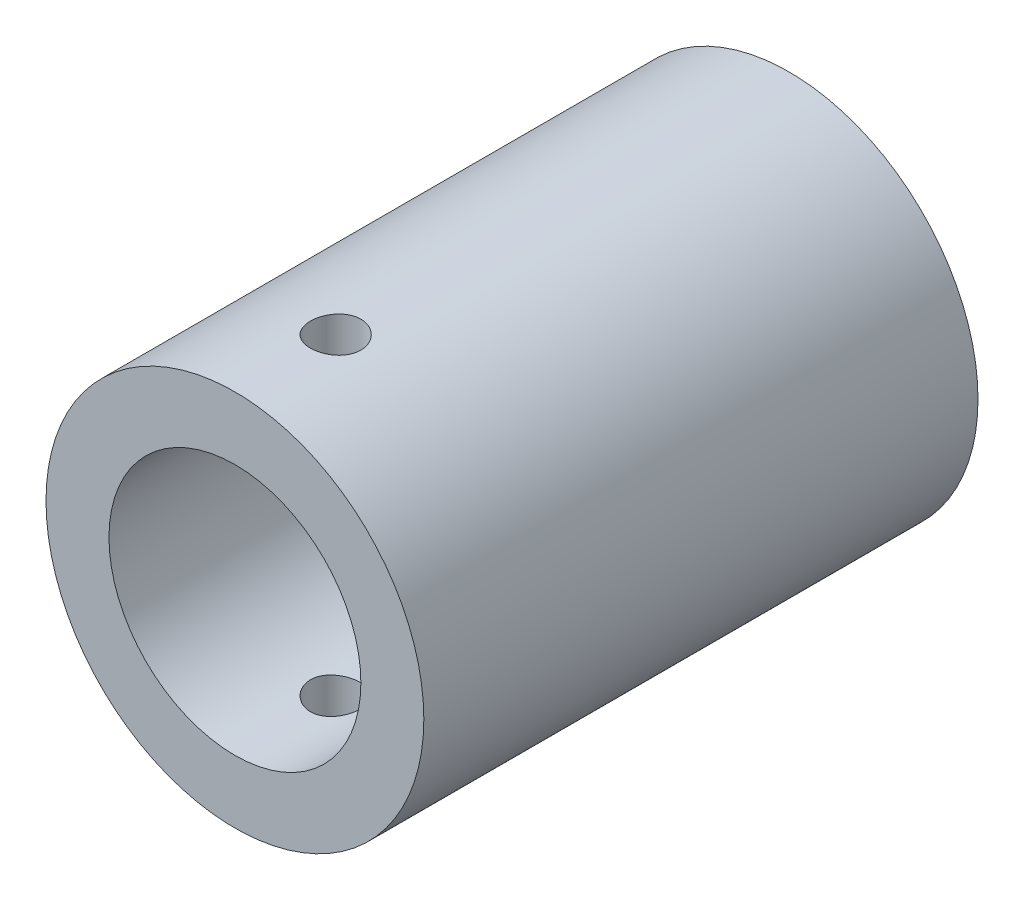
ISO-10303-21;
HEADER;
FILE_DESCRIPTION(('STEP AP214'),'2;1');
FILE_NAME('part.step','',(''),(''),'','','');
FILE_SCHEMA(('AUTOMOTIVE_DESIGN { 1 0 10303 214 1 1 1 1 }'));
ENDSEC;
DATA;
#1=APPLICATION_CONTEXT('core data for automotive mechanical design processes');
#2=APPLICATION_PROTOCOL_DEFINITION('international standard','automotive_design',2000,#1);
#3=PRODUCT_CONTEXT('',#1,'mechanical');
#4=PRODUCT('Part','Part','',(#3));
#5=PRODUCT_RELATED_PRODUCT_CATEGORY('part','',(#4));
#6=PRODUCT_DEFINITION_FORMATION('','',#4);
#7=PRODUCT_DEFINITION_CONTEXT('part definition',#1,'design');
#8=PRODUCT_DEFINITION('design','',#6,#7);
#9=PRODUCT_DEFINITION_SHAPE('','',#8);
#10=(LENGTH_UNIT() NAMED_UNIT(*) SI_UNIT(.MILLI.,.METRE.));
#11=(NAMED_UNIT(*) PLANE_ANGLE_UNIT() SI_UNIT($,.RADIAN.));
#12=(NAMED_UNIT(*) SI_UNIT($,.STERADIAN.) SOLID_ANGLE_UNIT());
#13=UNCERTAINTY_MEASURE_WITH_UNIT(LENGTH_MEASURE(1.E-05),#10,'distance_accuracy_value','');
#14=(GEOMETRIC_REPRESENTATION_CONTEXT(3) GLOBAL_UNCERTAINTY_ASSIGNED_CONTEXT((#13)) GLOBAL_UNIT_ASSIGNED_CONTEXT((#10,
#11,#12)) REPRESENTATION_CONTEXT('',''));
#15=CARTESIAN_POINT('',(0.,0.,0.));
#16=DIRECTION('',(0.,0.,1.));
#17=DIRECTION('',(1.,0.,0.));
#18=AXIS2_PLACEMENT_3D('',#15,#16,#17);
#19=CARTESIAN_POINT('',(0.,0.,44.));
#20=DIRECTION('',(0.,0.,-1.));
#21=DIRECTION('',(-1.,0.,0.));
#22=AXIS2_PLACEMENT_3D('',#19,#20,#21);
#23=CYLINDRICAL_SURFACE('',#22,15.);
#24=CARTESIAN_POINT('',(0.,-15.,38.));
#25=CARTESIAN_POINT('',(0.111808835669284,-14.9999983574254,37.9999952902931));
#26=CARTESIAN_POINT('',(0.223685979276279,-14.9987367072719,37.9905924620375));
#27=CARTESIAN_POINT('',(0.444322725138078,-14.993825111269,37.9532336509504));
#28=CARTESIAN_POINT('',(0.553079022333037,-14.9901727244172,37.9252587051029));
#29=CARTESIAN_POINT('',(0.764248312626984,-14.9808907984907,37.8515982824585));
#30=CARTESIAN_POINT('',(0.866665683058492,-14.9752626421097,37.8059251889616));
#31=CARTESIAN_POINT('',(1.0623638950303,-14.9626538666039,37.6981930861937));
#32=CARTESIAN_POINT('',(1.15564620633702,-14.9556734655857,37.6361367188335));
#33=CARTESIAN_POINT('',(1.33102582250468,-14.9410899478996,37.4969867383958));
#34=CARTESIAN_POINT('',(1.41305798549586,-14.9334835816211,37.4198113549915));
#35=CARTESIAN_POINT('',(1.56304735673101,-14.9185313755795,37.2527898109233));
#36=CARTESIAN_POINT('',(1.63100381997221,-14.9111855496234,37.1629429800042));
#37=CARTESIAN_POINT('',(1.75115902268908,-14.8975543544019,36.972700877055));
#38=CARTESIAN_POINT('',(1.80329607482578,-14.8912731776576,36.8722663175214));
#39=CARTESIAN_POINT('',(1.8899384500729,-14.8805258737923,36.6639689327632));
#40=CARTESIAN_POINT('',(1.92444453245278,-14.8760596685121,36.5561064276467));
#41=CARTESIAN_POINT('',(1.97464606772174,-14.8694793656867,36.3366941894983));
#42=CARTESIAN_POINT('',(1.99045204228507,-14.8673514537014,36.2251701654671));
#43=CARTESIAN_POINT('',(2.00314680548117,-14.8656465160931,36.001033820394));
#44=CARTESIAN_POINT('',(2.00003645633601,-14.866069374204,35.8884215491891));
#45=CARTESIAN_POINT('',(1.97507745939235,-14.8694055577299,35.6660788699721));
#46=CARTESIAN_POINT('',(1.95335097531762,-14.8723026462234,35.5563344701143));
#47=CARTESIAN_POINT('',(1.89196724634372,-14.8802355277475,35.3420631632399));
#48=CARTESIAN_POINT('',(1.85230959261457,-14.8852713695413,35.237536375245));
#49=CARTESIAN_POINT('',(1.75605929143191,-14.8969326111103,35.0362903652928));
#50=CARTESIAN_POINT('',(1.69941397913749,-14.903562941239,34.9395966288057));
#51=CARTESIAN_POINT('',(1.57083393344289,-14.9176623621993,34.7570409180823));
#52=CARTESIAN_POINT('',(1.49889840502385,-14.9251314966353,34.6711795074458));
#53=CARTESIAN_POINT('',(1.34110490026362,-14.9401389923359,34.5120169874181));
#54=CARTESIAN_POINT('',(1.25514170702645,-14.947677435412,34.4388201572977));
#55=CARTESIAN_POINT('',(1.07209417013341,-14.9619192381826,34.3078779550716));
#56=CARTESIAN_POINT('',(0.97500979444237,-14.9686225954715,34.2501326274765));
#57=CARTESIAN_POINT('',(0.772392219730469,-14.9804439374358,34.1517308823053));
#58=CARTESIAN_POINT('',(0.66685557884123,-14.9855612720896,34.1110814689537));
#59=CARTESIAN_POINT('',(0.450370924336248,-14.9936282590407,34.0481106810277));
#60=CARTESIAN_POINT('',(0.339423199542256,-14.9965780268993,34.0257883293606));
#61=CARTESIAN_POINT('',(0.116166903325642,-14.9999624137686,34.0002415672289));
#62=CARTESIAN_POINT('',(0.00387503454704113,-15.0004159384905,33.9968735982165));
#63=CARTESIAN_POINT('',(-0.219671617218718,-14.9988079153852,34.0089516641272));
#64=CARTESIAN_POINT('',(-0.330926425345665,-14.996746428686,34.0243972417824));
#65=CARTESIAN_POINT('',(-0.548813715572938,-14.990351753581,34.073544653384));
#66=CARTESIAN_POINT('',(-0.655462016512045,-14.9860271430292,34.1071775683222));
#67=CARTESIAN_POINT('',(-0.861605098793561,-14.9755900925429,34.1916729659371));
#68=CARTESIAN_POINT('',(-0.961099607015639,-14.9694775843944,34.2425361060132));
#69=CARTESIAN_POINT('',(-1.15074887861608,-14.9560983737007,34.3603921555833));
#70=CARTESIAN_POINT('',(-1.24084581439661,-14.9488251504572,34.4274773657133));
#71=CARTESIAN_POINT('',(-1.4085529469919,-14.9339572870998,34.5757433292243));
#72=CARTESIAN_POINT('',(-1.48616257662379,-14.9263626324062,34.6569247225164));
#73=CARTESIAN_POINT('',(-1.62720549423098,-14.9116490247351,34.8317131426396));
#74=CARTESIAN_POINT('',(-1.69054327608938,-14.904533487753,34.9253975667382));
#75=CARTESIAN_POINT('',(-1.80058351078814,-14.8916413300182,35.1221594102809));
#76=CARTESIAN_POINT('',(-1.84728633510347,-14.8858646793678,35.2252366199104));
#77=CARTESIAN_POINT('',(-1.92257836500746,-14.8763281178008,35.4375572420277));
#78=CARTESIAN_POINT('',(-1.95122028846796,-14.872562342326,35.5467816852108));
#79=CARTESIAN_POINT('',(-1.98974667143959,-14.8674574869829,35.7685436321288));
#80=CARTESIAN_POINT('',(-1.99963213426782,-14.8661182773134,35.8810809583244));
#81=CARTESIAN_POINT('',(-2.00034485806189,-14.8660223129545,36.1053234908535));
#82=CARTESIAN_POINT('',(-1.99132219194493,-14.8672452228252,36.2170282409642));
#83=CARTESIAN_POINT('',(-1.95479376686689,-14.872091838742,36.4373178751039));
#84=CARTESIAN_POINT('',(-1.92728801483269,-14.8757155438883,36.545902760302));
#85=CARTESIAN_POINT('',(-1.85462310332207,-14.8849489027276,36.7568436832516));
#86=CARTESIAN_POINT('',(-1.80947220819041,-14.890557626594,36.8592026111169));
#87=CARTESIAN_POINT('',(-1.70281342759737,-14.9031304571282,37.0549158838261));
#88=CARTESIAN_POINT('',(-1.64130522630429,-14.910094589966,37.148270054756));
#89=CARTESIAN_POINT('',(-1.50312448509508,-14.9246596718306,37.3240896499284));
#90=CARTESIAN_POINT('',(-1.42634027226901,-14.9322650575408,37.4064669477551));
#91=CARTESIAN_POINT('',(-1.26002169349824,-14.9472171900166,37.5572232163615));
#92=CARTESIAN_POINT('',(-1.17048434072978,-14.9545638756898,37.6255988987502));
#93=CARTESIAN_POINT('',(-0.980752987852825,-14.9682063513753,37.7466671384665));
#94=CARTESIAN_POINT('',(-0.880514620743968,-14.9744974642689,37.7992906665552));
#95=CARTESIAN_POINT('',(-0.67259240958733,-14.9852732065897,37.8868805985451));
#96=CARTESIAN_POINT('',(-0.56491667896989,-14.9897597692431,37.9218659086249));
#97=CARTESIAN_POINT('',(-0.380588408098419,-14.9953572174327,37.9649480063852));
#98=CARTESIAN_POINT('',(-0.305091081955779,-14.9970896363507,37.9780732435236));
#99=CARTESIAN_POINT('',(-0.153073171616112,-14.9994115849077,37.9956008141655));
#100=CARTESIAN_POINT('',(-0.0765525964512404,-15.000001124628,38.0000032246136));
#101=CARTESIAN_POINT('',(0.,-15.,38.));
#102=B_SPLINE_CURVE_WITH_KNOTS('',3,(#24,#25,#26,#27,#28,#29,#30,#31,#32,#33,#34,#35,#36,#37,
#38,#39,#40,#41,#42,#43,#44,#45,#46,#47,#48,#49,#50,#51,#52,#53,#54,#55,#56,#57,#58,#59,#60,#61,
#62,#63,#64,#65,#66,#67,#68,#69,#70,#71,#72,#73,#74,#75,#76,#77,#78,#79,#80,#81,#82,#83,#84,#85,
#86,#87,#88,#89,#90,#91,#92,#93,#94,#95,#96,#97,#98,#99,#100,#101),.UNSPECIFIED.,.T.,.F.,(4,2,2,
2,2,2,2,2,2,2,2,2,2,2,2,2,2,2,2,2,2,2,2,2,2,2,2,2,2,2,2,2,2,2,2,2,2,2,4),(0.,0.335146851305743,
0.670636430885044,1.0058916928274,1.34109292564034,1.67815978443559,2.01524447904836,
2.35362721511648,2.69199537766205,3.02835355914359,3.3646964092492,3.69884885098044,
4.0330089117585,4.36821583137898,4.70344018443797,5.04130544484849,5.37917167852296,
5.71717620202539,6.05516270391743,6.39058584992061,6.72600084354478,7.06015363396464,
7.39431917503546,7.73043274769884,8.06656158258762,8.40487704535451,8.74318495273048,
9.08050074735455,9.41779849783635,9.75242927496624,10.0870599266874,10.4215340370262,
10.756014605959,11.0930366783511,11.4301378125116,11.7686952667452,12.1068890499242,
12.3363573904731,12.5658237068544),.UNSPECIFIED.);
#103=CARTESIAN_POINT('',(0.,-15.,38.));
#104=VERTEX_POINT('',#103);
#105=EDGE_CURVE('E78',#104,#104,#102,.T.);
#106=ORIENTED_EDGE('',*,*,#105,.T.);
#107=EDGE_LOOP('',(#106));
#108=FACE_BOUND('',#107,.T.);
#109=CARTESIAN_POINT('',(0.,15.,38.));
#110=CARTESIAN_POINT('',(-0.111808835669284,14.9999983574254,37.9999952902931));
#111=CARTESIAN_POINT('',(-0.22368597927628,14.9987367072719,37.9905924620375));
#112=CARTESIAN_POINT('',(-0.444322725138079,14.9938251112691,37.9532336509504));
#113=CARTESIAN_POINT('',(-0.553079022333038,14.9901727244172,37.9252587051029));
#114=CARTESIAN_POINT('',(-0.764248312626986,14.9808907984907,37.8515982824585));
#115=CARTESIAN_POINT('',(-0.866665683058495,14.9752626421097,37.8059251889616));
#116=CARTESIAN_POINT('',(-1.0623638950303,14.9626538666039,37.6981930861937));
#117=CARTESIAN_POINT('',(-1.15564620633703,14.9556734655857,37.6361367188335));
#118=CARTESIAN_POINT('',(-1.33102582250468,14.9410899478996,37.4969867383958));
#119=CARTESIAN_POINT('',(-1.41305798549587,14.9334835816211,37.4198113549915));
#120=CARTESIAN_POINT('',(-1.56304735673102,14.9185313755795,37.2527898109233));
#121=CARTESIAN_POINT('',(-1.63100381997221,14.9111855496234,37.1629429800042));
#122=CARTESIAN_POINT('',(-1.75115902268908,14.8975543544019,36.972700877055));
#123=CARTESIAN_POINT('',(-1.80329607482578,14.8912731776576,36.8722663175214));
#124=CARTESIAN_POINT('',(-1.8899384500729,14.8805258737923,36.6639689327632));
#125=CARTESIAN_POINT('',(-1.92444453245278,14.8760596685121,36.5561064276467));
#126=CARTESIAN_POINT('',(-1.97464606772174,14.8694793656867,36.3366941894983));
#127=CARTESIAN_POINT('',(-1.99045204228507,14.8673514537014,36.2251701654671));
#128=CARTESIAN_POINT('',(-2.00314680548117,14.8656465160931,36.001033820394));
#129=CARTESIAN_POINT('',(-2.00003645633601,14.866069374204,35.8884215491891));
#130=CARTESIAN_POINT('',(-1.97507745939234,14.8694055577299,35.6660788699721));
#131=CARTESIAN_POINT('',(-1.95335097531762,14.8723026462234,35.5563344701143));
#132=CARTESIAN_POINT('',(-1.89196724634372,14.8802355277475,35.3420631632399));
#133=CARTESIAN_POINT('',(-1.85230959261457,14.8852713695413,35.237536375245));
#134=CARTESIAN_POINT('',(-1.75605929143191,14.8969326111103,35.0362903652928));
#135=CARTESIAN_POINT('',(-1.69941397913749,14.903562941239,34.9395966288057));
#136=CARTESIAN_POINT('',(-1.57083393344289,14.9176623621993,34.7570409180823));
#137=CARTESIAN_POINT('',(-1.49889840502385,14.9251314966353,34.6711795074458));
#138=CARTESIAN_POINT('',(-1.34110490026362,14.9401389923359,34.5120169874181));
#139=CARTESIAN_POINT('',(-1.25514170702645,14.947677435412,34.4388201572977));
#140=CARTESIAN_POINT('',(-1.07209417013341,14.9619192381826,34.3078779550716));
#141=CARTESIAN_POINT('',(-0.97500979444237,14.9686225954715,34.2501326274765));
#142=CARTESIAN_POINT('',(-0.772392219730469,14.9804439374358,34.1517308823053));
#143=CARTESIAN_POINT('',(-0.66685557884123,14.9855612720896,34.1110814689537));
#144=CARTESIAN_POINT('',(-0.450370924336248,14.9936282590407,34.0481106810277));
#145=CARTESIAN_POINT('',(-0.339423199542255,14.9965780268993,34.0257883293606));
#146=CARTESIAN_POINT('',(-0.116166903325641,14.9999624137686,34.0002415672289));
#147=CARTESIAN_POINT('',(-0.00387503454704033,15.0004159384905,33.9968735982165));
#148=CARTESIAN_POINT('',(0.219671617218719,14.9988079153852,34.0089516641272));
#149=CARTESIAN_POINT('',(0.330926425345666,14.996746428686,34.0243972417824));
#150=CARTESIAN_POINT('',(0.548813715572939,14.990351753581,34.073544653384));
#151=CARTESIAN_POINT('',(0.655462016512046,14.9860271430292,34.1071775683222));
#152=CARTESIAN_POINT('',(0.861605098793562,14.9755900925429,34.1916729659371));
#153=CARTESIAN_POINT('',(0.96109960701564,14.9694775843944,34.2425361060132));
#154=CARTESIAN_POINT('',(1.15074887861608,14.9560983737007,34.3603921555833));
#155=CARTESIAN_POINT('',(1.24084581439661,14.9488251504572,34.4274773657133));
#156=CARTESIAN_POINT('',(1.4085529469919,14.9339572870998,34.5757433292243));
#157=CARTESIAN_POINT('',(1.48616257662379,14.9263626324062,34.6569247225164));
#158=CARTESIAN_POINT('',(1.62720549423098,14.9116490247351,34.8317131426396));
#159=CARTESIAN_POINT('',(1.69054327608939,14.904533487753,34.9253975667382));
#160=CARTESIAN_POINT('',(1.80058351078814,14.8916413300182,35.1221594102809));
#161=CARTESIAN_POINT('',(1.84728633510347,14.8858646793678,35.2252366199104));
#162=CARTESIAN_POINT('',(1.92257836500746,14.8763281178008,35.4375572420277));
#163=CARTESIAN_POINT('',(1.95122028846796,14.872562342326,35.5467816852108));
#164=CARTESIAN_POINT('',(1.98974667143959,14.8674574869829,35.7685436321288));
#165=CARTESIAN_POINT('',(1.99963213426782,14.8661182773134,35.8810809583244));
#166=CARTESIAN_POINT('',(2.00034485806189,14.8660223129545,36.1053234908535));
#167=CARTESIAN_POINT('',(1.99132219194493,14.8672452228252,36.2170282409642));
#168=CARTESIAN_POINT('',(1.95479376686689,14.872091838742,36.4373178751039));
#169=CARTESIAN_POINT('',(1.92728801483269,14.8757155438883,36.545902760302));
#170=CARTESIAN_POINT('',(1.85462310332207,14.8849489027276,36.7568436832516));
#171=CARTESIAN_POINT('',(1.80947220819041,14.890557626594,36.8592026111169));
#172=CARTESIAN_POINT('',(1.70281342759737,14.9031304571282,37.0549158838261));
#173=CARTESIAN_POINT('',(1.64130522630429,14.910094589966,37.148270054756));
#174=CARTESIAN_POINT('',(1.50312448509508,14.9246596718306,37.3240896499284));
#175=CARTESIAN_POINT('',(1.42634027226901,14.9322650575408,37.4064669477551));
#176=CARTESIAN_POINT('',(1.26002169349824,14.9472171900166,37.5572232163615));
#177=CARTESIAN_POINT('',(1.17048434072978,14.9545638756898,37.6255988987502));
#178=CARTESIAN_POINT('',(0.980752987852825,14.9682063513753,37.7466671384665));
#179=CARTESIAN_POINT('',(0.880514620743967,14.9744974642689,37.7992906665552));
#180=CARTESIAN_POINT('',(0.67259240958733,14.9852732065897,37.8868805985451));
#181=CARTESIAN_POINT('',(0.56491667896989,14.9897597692431,37.9218659086249));
#182=CARTESIAN_POINT('',(0.380588408098419,14.9953572174327,37.9649480063852));
#183=CARTESIAN_POINT('',(0.305091081955779,14.9970896363507,37.9780732435236));
#184=CARTESIAN_POINT('',(0.153073171616112,14.9994115849077,37.9956008141655));
#185=CARTESIAN_POINT('',(0.0765525964512405,15.000001124628,38.0000032246136));
#186=CARTESIAN_POINT('',(0.,15.,38.));
#187=B_SPLINE_CURVE_WITH_KNOTS('',3,(#109,#110,#111,#112,#113,#114,#115,#116,#117,#118,#119,
#120,#121,#122,#123,#124,#125,#126,#127,#128,#129,#130,#131,#132,#133,#134,#135,#136,#137,#138,
#139,#140,#141,#142,#143,#144,#145,#146,#147,#148,#149,#150,#151,#152,#153,#154,#155,#156,#157,
#158,#159,#160,#161,#162,#163,#164,#165,#166,#167,#168,#169,#170,#171,#172,#173,#174,#175,#176,
#177,#178,#179,#180,#181,#182,#183,#184,#185,#186),.UNSPECIFIED.,.T.,.F.,(4,2,2,2,2,2,2,2,2,2,2,
2,2,2,2,2,2,2,2,2,2,2,2,2,2,2,2,2,2,2,2,2,2,2,2,2,2,2,4),(0.,0.335146851305744,
0.670636430885045,1.00589169282741,1.34109292564035,1.6781597844356,2.01524447904836,
2.35362721511648,2.69199537766205,3.0283535591436,3.36469640924921,3.69884885098044,
4.0330089117585,4.36821583137898,4.70344018443797,5.04130544484849,5.37917167852296,
5.71717620202539,6.05516270391743,6.39058584992061,6.72600084354478,7.06015363396464,
7.39431917503546,7.73043274769884,8.06656158258762,8.40487704535451,8.74318495273048,
9.08050074735455,9.41779849783635,9.75242927496624,10.0870599266874,10.4215340370262,
10.756014605959,11.0930366783511,11.4301378125116,11.7686952667452,12.1068890499242,
12.3363573904731,12.5658237068544),.UNSPECIFIED.);
#188=CARTESIAN_POINT('',(0.,15.,38.));
#189=VERTEX_POINT('',#188);
#190=EDGE_CURVE('E83',#189,#189,#187,.T.);
#191=ORIENTED_EDGE('',*,*,#190,.T.);
#192=EDGE_LOOP('',(#191));
#193=FACE_BOUND('',#192,.T.);
#194=CARTESIAN_POINT('',(0.,0.,44.));
#195=DIRECTION('',(0.,0.,1.));
#196=DIRECTION('',(1.,0.,0.));
#197=AXIS2_PLACEMENT_3D('',#194,#195,#196);
#198=CIRCLE('',#197,15.);
#199=CARTESIAN_POINT('',(15.,0.,44.));
#200=VERTEX_POINT('',#199);
#201=EDGE_CURVE('E10',#200,#200,#198,.T.);
#202=ORIENTED_EDGE('',*,*,#201,.F.);
#203=EDGE_LOOP('',(#202));
#204=FACE_BOUND('',#203,.T.);
#205=CARTESIAN_POINT('',(0.,0.,0.));
#206=DIRECTION('',(0.,0.,1.));
#207=DIRECTION('',(1.,0.,0.));
#208=AXIS2_PLACEMENT_3D('',#205,#206,#207);
#209=CIRCLE('',#208,15.);
#210=CARTESIAN_POINT('',(15.,0.,0.));
#211=VERTEX_POINT('',#210);
#212=EDGE_CURVE('E48',#211,#211,#209,.T.);
#213=ORIENTED_EDGE('',*,*,#212,.T.);
#214=EDGE_LOOP('',(#213));
#215=FACE_BOUND('',#214,.T.);
#216=ADVANCED_FACE('F35',(#108,#193,#204,#215),#23,.T.);
#217=CARTESIAN_POINT('',(0.,0.,44.));
#218=DIRECTION('',(0.,0.,1.));
#219=DIRECTION('',(1.,0.,0.));
#220=AXIS2_PLACEMENT_3D('',#217,#218,#219);
#221=PLANE('',#220);
#222=CARTESIAN_POINT('',(0.,0.,44.));
#223=DIRECTION('',(0.,0.,1.));
#224=DIRECTION('',(1.,0.,0.));
#225=AXIS2_PLACEMENT_3D('',#222,#223,#224);
#226=CIRCLE('',#225,10.);
#227=CARTESIAN_POINT('',(10.,0.,44.));
#228=VERTEX_POINT('',#227);
#229=EDGE_CURVE('E56',#228,#228,#226,.T.);
#230=ORIENTED_EDGE('',*,*,#229,.F.);
#231=EDGE_LOOP('',(#230));
#232=FACE_BOUND('',#231,.T.);
#233=ORIENTED_EDGE('',*,*,#201,.T.);
#234=EDGE_LOOP('',(#233));
#235=FACE_BOUND('',#234,.T.);
#236=ADVANCED_FACE('F95',(#232,#235),#221,.T.);
#237=CARTESIAN_POINT('',(0.,0.,0.));
#238=DIRECTION('',(0.,0.,1.));
#239=DIRECTION('',(1.,0.,0.));
#240=AXIS2_PLACEMENT_3D('',#237,#238,#239);
#241=PLANE('',#240);
#242=ORIENTED_EDGE('',*,*,#212,.F.);
#243=EDGE_LOOP('',(#242));
#244=FACE_BOUND('',#243,.T.);
#245=ADVANCED_FACE('F97',(#244),#241,.F.);
#246=CARTESIAN_POINT('',(0.,0.,14.));
#247=DIRECTION('',(0.,0.,1.));
#248=DIRECTION('',(1.,0.,0.));
#249=AXIS2_PLACEMENT_3D('',#246,#247,#248);
#250=CYLINDRICAL_SURFACE('',#249,10.);
#251=CARTESIAN_POINT('',(0.,-10.,38.));
#252=CARTESIAN_POINT('',(-0.111153813585266,-9.99999795161743,37.9999959110033));
#253=CARTESIAN_POINT('',(-0.222359320403044,-9.99812770356462,37.9907023140647));
#254=CARTESIAN_POINT('',(-0.441627015378037,-9.99084731246462,37.9538029997695));
#255=CARTESIAN_POINT('',(-0.549686635082711,-9.98543435720372,37.926182734397));
#256=CARTESIAN_POINT('',(-0.759460610526625,-9.97167298556573,37.8535174527584));
#257=CARTESIAN_POINT('',(-0.861180935866266,-9.96332738153436,37.8084891263106));
#258=CARTESIAN_POINT('',(-1.05561597772845,-9.94460796070629,37.7023355049774));
#259=CARTESIAN_POINT('',(-1.14833123015162,-9.93423426471414,37.6412111687856));
#260=CARTESIAN_POINT('',(-1.32338695462973,-9.9124433065994,37.5037230114171));
#261=CARTESIAN_POINT('',(-1.40558790231705,-9.90101491008695,37.4271832892176));
#262=CARTESIAN_POINT('',(-1.55607351321606,-9.87848360905177,37.2614151672166));
#263=CARTESIAN_POINT('',(-1.62435708954085,-9.86738073000847,37.1721857773298));
#264=CARTESIAN_POINT('',(-1.74566350669524,-9.8466488362523,36.9825676139762));
#265=CARTESIAN_POINT('',(-1.79854187773173,-9.83703414729892,36.8820847124073));
#266=CARTESIAN_POINT('',(-1.88661133316062,-9.82052536116836,36.6734363619918));
#267=CARTESIAN_POINT('',(-1.92180416487448,-9.81363099523923,36.5652716733073));
#268=CARTESIAN_POINT('',(-1.97305059976966,-9.80345610504409,36.3458312721842));
#269=CARTESIAN_POINT('',(-1.98934899591755,-9.80012940214375,36.2346149117155));
#270=CARTESIAN_POINT('',(-2.00310425545224,-9.79732750121254,36.0109803572713));
#271=CARTESIAN_POINT('',(-2.000563045427,-9.79785190935681,35.8985622873597));
#272=CARTESIAN_POINT('',(-1.97690914620364,-9.80265102296369,35.677506423958));
#273=CARTESIAN_POINT('',(-1.95607708048781,-9.80686905717527,35.5688371887454));
#274=CARTESIAN_POINT('',(-1.8968757692461,-9.81849092320002,35.356567846674));
#275=CARTESIAN_POINT('',(-1.85850568620136,-9.82589490715558,35.252967982162));
#276=CARTESIAN_POINT('',(-1.76504956734944,-9.84311237000816,35.0529694765928));
#277=CARTESIAN_POINT('',(-1.70985230246423,-9.85294179627409,34.9566242408617));
#278=CARTESIAN_POINT('',(-1.58438714914536,-9.87389237546124,34.7744583000544));
#279=CARTESIAN_POINT('',(-1.51411752871366,-9.88501367676732,34.6886388062977));
#280=CARTESIAN_POINT('',(-1.35899986912117,-9.90754042482924,34.5283411950861));
#281=CARTESIAN_POINT('',(-1.27391232242489,-9.9189473842181,34.4540948642817));
#282=CARTESIAN_POINT('',(-1.09237004812402,-9.94057697428817,34.3208923073975));
#283=CARTESIAN_POINT('',(-0.99591517475878,-9.95079958977947,34.2619362774128));
#284=CARTESIAN_POINT('',(-0.794118773757844,-9.96893380321774,34.160944981548));
#285=CARTESIAN_POINT('',(-0.688763639170602,-9.97684177696544,34.1189362127109));
#286=CARTESIAN_POINT('',(-0.472297952897329,-9.98942817975716,34.0532790519229));
#287=CARTESIAN_POINT('',(-0.361188100144898,-9.99410700001063,34.0296284358527));
#288=CARTESIAN_POINT('',(-0.138358811254299,-9.99965343733735,34.0016870924114));
#289=CARTESIAN_POINT('',(-0.0266806566511506,-10.0005834930494,33.9970791609195));
#290=CARTESIAN_POINT('',(0.195849868385429,-9.99870103860205,34.0064997178844));
#291=CARTESIAN_POINT('',(0.306702284887587,-9.99588873882892,34.0205271587052));
#292=CARTESIAN_POINT('',(0.523411319893082,-9.98687664016035,34.0665567470879));
#293=CARTESIAN_POINT('',(0.629303896679806,-9.98070752808413,34.0983961369958));
#294=CARTESIAN_POINT('',(0.834247254999333,-9.96567104122065,34.1789679653116));
#295=CARTESIAN_POINT('',(0.933297523275077,-9.95680346428454,34.2277016693537));
#296=CARTESIAN_POINT('',(1.12308234737243,-9.93719823066589,34.3413649813026));
#297=CARTESIAN_POINT('',(1.21370025350438,-9.92643900874104,34.4064855620779));
#298=CARTESIAN_POINT('',(1.38283603823841,-9.90429469659765,34.5508183824146));
#299=CARTESIAN_POINT('',(1.46135261786152,-9.89290953936776,34.6300321327997));
#300=CARTESIAN_POINT('',(1.60528118154835,-9.8705860711393,34.8017467037822));
#301=CARTESIAN_POINT('',(1.67047540489731,-9.85965720466608,34.8944314884427));
#302=CARTESIAN_POINT('',(1.78437084010241,-9.83968383592388,35.0896227227134));
#303=CARTESIAN_POINT('',(1.83307271184581,-9.83063925826685,35.1921287791471));
#304=CARTESIAN_POINT('',(1.91230368316392,-9.81553481168766,35.4035364922991));
#305=CARTESIAN_POINT('',(1.9429269995821,-9.80945949744373,35.5124016824206));
#306=CARTESIAN_POINT('',(1.98541730325439,-9.8009487358405,35.7338669069818));
#307=CARTESIAN_POINT('',(1.99728673645023,-9.79851281382223,35.8464664524187));
#308=CARTESIAN_POINT('',(2.00184182173494,-9.79758299262758,36.0700177290886));
#309=CARTESIAN_POINT('',(1.99487157614179,-9.79901838378602,36.180962297854));
#310=CARTESIAN_POINT('',(1.96270460820012,-9.80551146969228,36.4000632998101));
#311=CARTESIAN_POINT('',(1.9375080322586,-9.81056913534338,36.5082197553896));
#312=CARTESIAN_POINT('',(1.86975713699791,-9.82370528438317,36.7184554224811));
#313=CARTESIAN_POINT('',(1.82724501343469,-9.83177642037661,36.8205487210048));
#314=CARTESIAN_POINT('',(1.72610928920321,-9.85003429948341,37.0162074414689));
#315=CARTESIAN_POINT('',(1.66748433754977,-9.86022121997788,37.1097721474503));
#316=CARTESIAN_POINT('',(1.53461182957283,-9.88177921046451,37.2874311443006));
#317=CARTESIAN_POINT('',(1.46011577447036,-9.89316745819399,37.3713375305352));
#318=CARTESIAN_POINT('',(1.29812873802628,-9.91572163743909,37.5255724110583));
#319=CARTESIAN_POINT('',(1.21063477430667,-9.92688751726369,37.5958977806345));
#320=CARTESIAN_POINT('',(1.02403525817649,-9.94787664775943,37.7216692878929));
#321=CARTESIAN_POINT('',(0.924817768859665,-9.95768462438492,37.77695200656));
#322=CARTESIAN_POINT('',(0.71833272188146,-9.9747025017,37.8699722451932));
#323=CARTESIAN_POINT('',(0.611072521726249,-9.98191474277232,37.907725579065));
#324=CARTESIAN_POINT('',(0.419642977847557,-9.99152745190741,37.9573038960894));
#325=CARTESIAN_POINT('',(0.336563328027568,-9.99468606316903,37.9732863874155));
#326=CARTESIAN_POINT('',(0.168999050420134,-9.99892308279786,37.9946358247167));
#327=CARTESIAN_POINT('',(0.084514467497238,-10.0000015574631,38.0000031090195));
#328=CARTESIAN_POINT('',(0.,-10.,38.));
#329=B_SPLINE_CURVE_WITH_KNOTS('',3,(#251,#252,#253,#254,#255,#256,#257,#258,#259,#260,#261,
#262,#263,#264,#265,#266,#267,#268,#269,#270,#271,#272,#273,#274,#275,#276,#277,#278,#279,#280,
#281,#282,#283,#284,#285,#286,#287,#288,#289,#290,#291,#292,#293,#294,#295,#296,#297,#298,#299,
#300,#301,#302,#303,#304,#305,#306,#307,#308,#309,#310,#311,#312,#313,#314,#315,#316,#317,#318,
#319,#320,#321,#322,#323,#324,#325,#326,#327,#328),.UNSPECIFIED.,.T.,.F.,(4,2,2,2,2,2,2,2,2,2,2,
2,2,2,2,2,2,2,2,2,2,2,2,2,2,2,2,2,2,2,2,2,2,2,2,2,2,2,4),(0.,0.333152261322515,
0.666569301382646,0.999667470500682,1.33274580446172,1.66986534022437,2.00701119349473,
2.34722390011846,2.68740298730395,3.02312370207174,3.35881008562451,3.68943454012557,
4.02007478507459,4.35294980407185,4.68586309499341,5.02476504982701,5.3636713507964,
5.70310549708048,6.04249851396072,6.37621471352531,6.70991215315735,7.04060907901447,
7.37133078432045,7.70610132066717,8.0409077669186,8.38081257158453,8.72070377446934,
9.05880762065447,9.3968673666083,9.72879445135404,10.0607188698522,10.3918392250622,
10.7229873516373,11.0597615247829,11.3966130906586,11.7369899335128,12.0770591103504,
12.3303755057979,12.5836838274199),.UNSPECIFIED.);
#330=CARTESIAN_POINT('',(0.,-10.,38.));
#331=VERTEX_POINT('',#330);
#332=EDGE_CURVE('E39',#331,#331,#329,.T.);
#333=ORIENTED_EDGE('',*,*,#332,.T.);
#334=EDGE_LOOP('',(#333));
#335=FACE_BOUND('',#334,.T.);
#336=CARTESIAN_POINT('',(0.,9.99999999999999,38.));
#337=CARTESIAN_POINT('',(0.111153813585266,9.99999795161741,37.9999959110033));
#338=CARTESIAN_POINT('',(0.222359320403044,9.99812770356462,37.9907023140647));
#339=CARTESIAN_POINT('',(0.441627015378039,9.99084731246463,37.9538029997695));
#340=CARTESIAN_POINT('',(0.549686635082712,9.98543435720372,37.926182734397));
#341=CARTESIAN_POINT('',(0.759460610526629,9.97167298556573,37.8535174527584));
#342=CARTESIAN_POINT('',(0.861180935866273,9.96332738153436,37.8084891263106));
#343=CARTESIAN_POINT('',(1.05561597772846,9.94460796070629,37.7023355049774));
#344=CARTESIAN_POINT('',(1.14833123015163,9.93423426471414,37.6412111687856));
#345=CARTESIAN_POINT('',(1.32338695462973,9.91244330659939,37.5037230114171));
#346=CARTESIAN_POINT('',(1.40558790231705,9.90101491008695,37.4271832892176));
#347=CARTESIAN_POINT('',(1.55607351321606,9.87848360905177,37.2614151672166));
#348=CARTESIAN_POINT('',(1.62435708954085,9.86738073000848,37.1721857773298));
#349=CARTESIAN_POINT('',(1.74566350669524,9.8466488362523,36.9825676139762));
#350=CARTESIAN_POINT('',(1.79854187773173,9.83703414729892,36.8820847124073));
#351=CARTESIAN_POINT('',(1.88661133316062,9.82052536116836,36.6734363619918));
#352=CARTESIAN_POINT('',(1.92180416487448,9.81363099523923,36.5652716733073));
#353=CARTESIAN_POINT('',(1.97305059976966,9.80345610504409,36.3458312721842));
#354=CARTESIAN_POINT('',(1.98934899591755,9.80012940214375,36.2346149117155));
#355=CARTESIAN_POINT('',(2.00310425545224,9.79732750121254,36.0109803572713));
#356=CARTESIAN_POINT('',(2.000563045427,9.79785190935681,35.8985622873597));
#357=CARTESIAN_POINT('',(1.97690914620364,9.80265102296369,35.677506423958));
#358=CARTESIAN_POINT('',(1.95607708048781,9.80686905717527,35.5688371887454));
#359=CARTESIAN_POINT('',(1.8968757692461,9.81849092320002,35.356567846674));
#360=CARTESIAN_POINT('',(1.85850568620136,9.82589490715558,35.252967982162));
#361=CARTESIAN_POINT('',(1.76504956734944,9.84311237000816,35.0529694765928));
#362=CARTESIAN_POINT('',(1.70985230246423,9.85294179627409,34.9566242408617));
#363=CARTESIAN_POINT('',(1.58438714914536,9.87389237546124,34.7744583000544));
#364=CARTESIAN_POINT('',(1.51411752871366,9.88501367676732,34.6886388062977));
#365=CARTESIAN_POINT('',(1.35899986912117,9.90754042482924,34.5283411950861));
#366=CARTESIAN_POINT('',(1.27391232242489,9.9189473842181,34.4540948642817));
#367=CARTESIAN_POINT('',(1.09237004812402,9.94057697428817,34.3208923073975));
#368=CARTESIAN_POINT('',(0.99591517475878,9.95079958977947,34.2619362774128));
#369=CARTESIAN_POINT('',(0.794118773757844,9.96893380321774,34.160944981548));
#370=CARTESIAN_POINT('',(0.688763639170601,9.97684177696544,34.1189362127109));
#371=CARTESIAN_POINT('',(0.472297952897329,9.98942817975716,34.0532790519229));
#372=CARTESIAN_POINT('',(0.361188100144897,9.99410700001063,34.0296284358527));
#373=CARTESIAN_POINT('',(0.138358811254298,9.99965343733736,34.0016870924114));
#374=CARTESIAN_POINT('',(0.0266806566511501,10.0005834930494,33.9970791609195));
#375=CARTESIAN_POINT('',(-0.19584986838543,9.99870103860205,34.0064997178844));
#376=CARTESIAN_POINT('',(-0.306702284887589,9.99588873882892,34.0205271587052));
#377=CARTESIAN_POINT('',(-0.523411319893084,9.98687664016035,34.0665567470879));
#378=CARTESIAN_POINT('',(-0.629303896679808,9.98070752808413,34.0983961369958));
#379=CARTESIAN_POINT('',(-0.834247254999336,9.96567104122065,34.1789679653116));
#380=CARTESIAN_POINT('',(-0.933297523275082,9.95680346428453,34.2277016693537));
#381=CARTESIAN_POINT('',(-1.12308234737244,9.93719823066589,34.3413649813026));
#382=CARTESIAN_POINT('',(-1.21370025350438,9.92643900874103,34.4064855620779));
#383=CARTESIAN_POINT('',(-1.38283603823842,9.90429469659765,34.5508183824146));
#384=CARTESIAN_POINT('',(-1.46135261786153,9.89290953936776,34.6300321327997));
#385=CARTESIAN_POINT('',(-1.60528118154835,9.8705860711393,34.8017467037822));
#386=CARTESIAN_POINT('',(-1.67047540489731,9.85965720466608,34.8944314884427));
#387=CARTESIAN_POINT('',(-1.78437084010241,9.83968383592388,35.0896227227134));
#388=CARTESIAN_POINT('',(-1.83307271184581,9.83063925826685,35.1921287791471));
#389=CARTESIAN_POINT('',(-1.91230368316392,9.81553481168766,35.4035364922991));
#390=CARTESIAN_POINT('',(-1.9429269995821,9.80945949744373,35.5124016824206));
#391=CARTESIAN_POINT('',(-1.98541730325439,9.8009487358405,35.7338669069818));
#392=CARTESIAN_POINT('',(-1.99728673645023,9.79851281382223,35.8464664524187));
#393=CARTESIAN_POINT('',(-2.00184182173494,9.79758299262758,36.0700177290886));
#394=CARTESIAN_POINT('',(-1.99487157614179,9.79901838378602,36.180962297854));
#395=CARTESIAN_POINT('',(-1.96270460820012,9.80551146969228,36.4000632998101));
#396=CARTESIAN_POINT('',(-1.9375080322586,9.81056913534338,36.5082197553896));
#397=CARTESIAN_POINT('',(-1.86975713699791,9.82370528438317,36.7184554224811));
#398=CARTESIAN_POINT('',(-1.82724501343469,9.83177642037661,36.8205487210048));
#399=CARTESIAN_POINT('',(-1.72610928920321,9.85003429948341,37.0162074414689));
#400=CARTESIAN_POINT('',(-1.66748433754977,9.86022121997788,37.1097721474503));
#401=CARTESIAN_POINT('',(-1.53461182957283,9.88177921046451,37.2874311443006));
#402=CARTESIAN_POINT('',(-1.46011577447036,9.89316745819399,37.3713375305352));
#403=CARTESIAN_POINT('',(-1.29812873802628,9.91572163743909,37.5255724110583));
#404=CARTESIAN_POINT('',(-1.21063477430667,9.92688751726369,37.5958977806345));
#405=CARTESIAN_POINT('',(-1.02403525817649,9.94787664775943,37.7216692878929));
#406=CARTESIAN_POINT('',(-0.924817768859664,9.95768462438492,37.77695200656));
#407=CARTESIAN_POINT('',(-0.718332721881459,9.9747025017,37.8699722451932));
#408=CARTESIAN_POINT('',(-0.611072521726248,9.98191474277232,37.907725579065));
#409=CARTESIAN_POINT('',(-0.419642977847556,9.99152745190741,37.9573038960894));
#410=CARTESIAN_POINT('',(-0.336563328027567,9.99468606316904,37.9732863874155));
#411=CARTESIAN_POINT('',(-0.168999050420133,9.99892308279785,37.9946358247167));
#412=CARTESIAN_POINT('',(-0.0845144674972375,10.0000015574631,38.0000031090195));
#413=CARTESIAN_POINT('',(0.,9.99999999999999,38.));
#414=B_SPLINE_CURVE_WITH_KNOTS('',3,(#336,#337,#338,#339,#340,#341,#342,#343,#344,#345,#346,
#347,#348,#349,#350,#351,#352,#353,#354,#355,#356,#357,#358,#359,#360,#361,#362,#363,#364,#365,
#366,#367,#368,#369,#370,#371,#372,#373,#374,#375,#376,#377,#378,#379,#380,#381,#382,#383,#384,
#385,#386,#387,#388,#389,#390,#391,#392,#393,#394,#395,#396,#397,#398,#399,#400,#401,#402,#403,
#404,#405,#406,#407,#408,#409,#410,#411,#412,#413),.UNSPECIFIED.,.T.,.F.,(4,2,2,2,2,2,2,2,2,2,2,
2,2,2,2,2,2,2,2,2,2,2,2,2,2,2,2,2,2,2,2,2,2,2,2,2,2,2,4),(0.,0.333152261322517,
0.666569301382647,0.999667470500688,1.33274580446173,1.66986534022438,2.00701119349473,
2.34722390011846,2.68740298730395,3.02312370207174,3.3588100856245,3.68943454012556,
4.02007478507459,4.35294980407185,4.68586309499341,5.02476504982701,5.36367135079641,
5.70310549708048,6.04249851396072,6.37621471352531,6.70991215315736,7.04060907901447,
7.37133078432046,7.70610132066718,8.04090776691861,8.38081257158453,8.72070377446934,
9.05880762065448,9.39686736660831,9.72879445135404,10.0607188698522,10.3918392250622,
10.7229873516373,11.0597615247829,11.3966130906586,11.7369899335128,12.0770591103504,
12.3303755057979,12.5836838274199),.UNSPECIFIED.);
#415=CARTESIAN_POINT('',(0.,9.99999999999999,38.));
#416=VERTEX_POINT('',#415);
#417=EDGE_CURVE('E58',#416,#416,#414,.T.);
#418=ORIENTED_EDGE('',*,*,#417,.T.);
#419=EDGE_LOOP('',(#418));
#420=FACE_BOUND('',#419,.T.);
#421=CARTESIAN_POINT('',(0.,0.,14.));
#422=DIRECTION('',(0.,0.,1.));
#423=DIRECTION('',(1.,0.,0.));
#424=AXIS2_PLACEMENT_3D('',#421,#422,#423);
#425=CIRCLE('',#424,10.);
#426=CARTESIAN_POINT('',(10.,0.,14.));
#427=VERTEX_POINT('',#426);
#428=EDGE_CURVE('E53',#427,#427,#425,.T.);
#429=ORIENTED_EDGE('',*,*,#428,.F.);
#430=EDGE_LOOP('',(#429));
#431=FACE_BOUND('',#430,.T.);
#432=ORIENTED_EDGE('',*,*,#229,.T.);
#433=EDGE_LOOP('',(#432));
#434=FACE_BOUND('',#433,.T.);
#435=ADVANCED_FACE('F63',(#335,#420,#431,#434),#250,.F.);
#436=CARTESIAN_POINT('',(0.,0.,14.));
#437=DIRECTION('',(0.,0.,1.));
#438=DIRECTION('',(1.,0.,0.));
#439=AXIS2_PLACEMENT_3D('',#436,#437,#438);
#440=PLANE('',#439);
#441=ORIENTED_EDGE('',*,*,#428,.T.);
#442=EDGE_LOOP('',(#441));
#443=FACE_BOUND('',#442,.T.);
#444=ADVANCED_FACE('F71',(#443),#440,.T.);
#445=CARTESIAN_POINT('',(0.,-45.,36.));
#446=DIRECTION('',(0.,1.,0.));
#447=DIRECTION('',(0.,0.,1.));
#448=AXIS2_PLACEMENT_3D('',#445,#446,#447);
#449=CYLINDRICAL_SURFACE('',#448,2.);
#450=ORIENTED_EDGE('',*,*,#417,.F.);
#451=EDGE_LOOP('',(#450));
#452=FACE_BOUND('',#451,.T.);
#453=ORIENTED_EDGE('',*,*,#190,.F.);
#454=EDGE_LOOP('',(#453));
#455=FACE_BOUND('',#454,.T.);
#456=ADVANCED_FACE('F67',(#452,#455),#449,.F.);
#457=ORIENTED_EDGE('',*,*,#332,.F.);
#458=EDGE_LOOP('',(#457));
#459=FACE_BOUND('',#458,.T.);
#460=ORIENTED_EDGE('',*,*,#105,.F.);
#461=EDGE_LOOP('',(#460));
#462=FACE_BOUND('',#461,.T.);
#463=ADVANCED_FACE('F70',(#459,#462),#449,.F.);
#464=CLOSED_SHELL('',(#216,#236,#245,#435,#444,#456,#463));
#465=MANIFOLD_SOLID_BREP('B2',#464);
#466=ADVANCED_BREP_SHAPE_REPRESENTATION('',(#18,#465),#14);
#467=SHAPE_DEFINITION_REPRESENTATION(#9,#466);
ENDSEC;
END-ISO-10303-21;
